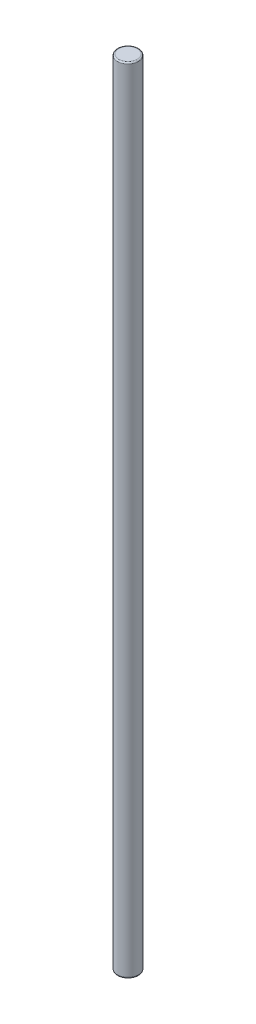
ISO-10303-21;
HEADER;
FILE_DESCRIPTION(('STEP AP214'),'2;1');
FILE_NAME('part.step','',(''),(''),'','','');
FILE_SCHEMA(('AUTOMOTIVE_DESIGN { 1 0 10303 214 1 1 1 1 }'));
ENDSEC;
DATA;
#1=APPLICATION_CONTEXT('core data for automotive mechanical design processes');
#2=APPLICATION_PROTOCOL_DEFINITION('international standard','automotive_design',2000,#1);
#3=PRODUCT_CONTEXT('',#1,'mechanical');
#4=PRODUCT('Part','Part','',(#3));
#5=PRODUCT_RELATED_PRODUCT_CATEGORY('part','',(#4));
#6=PRODUCT_DEFINITION_FORMATION('','',#4);
#7=PRODUCT_DEFINITION_CONTEXT('part definition',#1,'design');
#8=PRODUCT_DEFINITION('design','',#6,#7);
#9=PRODUCT_DEFINITION_SHAPE('','',#8);
#10=(LENGTH_UNIT() NAMED_UNIT(*) SI_UNIT(.MILLI.,.METRE.));
#11=(NAMED_UNIT(*) PLANE_ANGLE_UNIT() SI_UNIT($,.RADIAN.));
#12=(NAMED_UNIT(*) SI_UNIT($,.STERADIAN.) SOLID_ANGLE_UNIT());
#13=UNCERTAINTY_MEASURE_WITH_UNIT(LENGTH_MEASURE(1.E-05),#10,'distance_accuracy_value','');
#14=(GEOMETRIC_REPRESENTATION_CONTEXT(3) GLOBAL_UNCERTAINTY_ASSIGNED_CONTEXT((#13)) GLOBAL_UNIT_ASSIGNED_CONTEXT((#10,
#11,#12)) REPRESENTATION_CONTEXT('',''));
#15=CARTESIAN_POINT('',(0.,0.,0.));
#16=DIRECTION('',(0.,0.,1.));
#17=DIRECTION('',(1.,0.,0.));
#18=AXIS2_PLACEMENT_3D('',#15,#16,#17);
#19=CARTESIAN_POINT('',(0.,300.,0.));
#20=DIRECTION('',(0.,-1.,0.));
#21=DIRECTION('',(0.,0.,-1.));
#22=AXIS2_PLACEMENT_3D('',#19,#20,#21);
#23=CYLINDRICAL_SURFACE('',#22,4.);
#24=CARTESIAN_POINT('',(0.,299.5,0.));
#25=DIRECTION('',(0.,1.,0.));
#26=DIRECTION('',(0.,0.,1.));
#27=AXIS2_PLACEMENT_3D('',#24,#25,#26);
#28=CIRCLE('',#27,4.);
#29=CARTESIAN_POINT('',(0.,299.5,4.));
#30=VERTEX_POINT('',#29);
#31=EDGE_CURVE('E38',#30,#30,#28,.F.);
#32=ORIENTED_EDGE('',*,*,#31,.T.);
#33=EDGE_LOOP('',(#32));
#34=FACE_BOUND('',#33,.T.);
#35=CARTESIAN_POINT('',(0.,0.5,0.));
#36=DIRECTION('',(0.,1.,0.));
#37=DIRECTION('',(0.,0.,1.));
#38=AXIS2_PLACEMENT_3D('',#35,#36,#37);
#39=CIRCLE('',#38,4.);
#40=CARTESIAN_POINT('',(0.,0.5,4.));
#41=VERTEX_POINT('',#40);
#42=EDGE_CURVE('E42',#41,#41,#39,.T.);
#43=ORIENTED_EDGE('',*,*,#42,.T.);
#44=EDGE_LOOP('',(#43));
#45=FACE_BOUND('',#44,.T.);
#46=ADVANCED_FACE('F31',(#34,#45),#23,.T.);
#47=CARTESIAN_POINT('',(0.,300.,0.));
#48=DIRECTION('',(0.,1.,0.));
#49=DIRECTION('',(0.,0.,1.));
#50=AXIS2_PLACEMENT_3D('',#47,#48,#49);
#51=PLANE('',#50);
#52=CARTESIAN_POINT('',(0.,300.,0.));
#53=DIRECTION('',(0.,1.,0.));
#54=DIRECTION('',(0.,0.,1.));
#55=AXIS2_PLACEMENT_3D('',#52,#53,#54);
#56=CIRCLE('',#55,3.5);
#57=CARTESIAN_POINT('',(0.,300.,3.5));
#58=VERTEX_POINT('',#57);
#59=EDGE_CURVE('E46',#58,#58,#56,.T.);
#60=ORIENTED_EDGE('',*,*,#59,.T.);
#61=EDGE_LOOP('',(#60));
#62=FACE_BOUND('',#61,.T.);
#63=ADVANCED_FACE('F52',(#62),#51,.T.);
#64=CARTESIAN_POINT('',(0.,0.,0.));
#65=DIRECTION('',(0.,1.,0.));
#66=DIRECTION('',(0.,0.,1.));
#67=AXIS2_PLACEMENT_3D('',#64,#65,#66);
#68=PLANE('',#67);
#69=CARTESIAN_POINT('',(0.,0.,0.));
#70=DIRECTION('',(0.,1.,0.));
#71=DIRECTION('',(0.,0.,1.));
#72=AXIS2_PLACEMENT_3D('',#69,#70,#71);
#73=CIRCLE('',#72,3.5);
#74=CARTESIAN_POINT('',(0.,0.,3.5));
#75=VERTEX_POINT('',#74);
#76=EDGE_CURVE('E10',#75,#75,#73,.F.);
#77=ORIENTED_EDGE('',*,*,#76,.T.);
#78=EDGE_LOOP('',(#77));
#79=FACE_BOUND('',#78,.T.);
#80=ADVANCED_FACE('F56',(#79),#68,.F.);
#81=CARTESIAN_POINT('',(0.,299.5,0.));
#82=DIRECTION('',(0.,1.,0.));
#83=DIRECTION('',(0.,0.,1.));
#84=AXIS2_PLACEMENT_3D('',#81,#82,#83);
#85=TOROIDAL_SURFACE('',#84,3.5,0.5);
#86=ORIENTED_EDGE('',*,*,#31,.F.);
#87=EDGE_LOOP('',(#86));
#88=FACE_BOUND('',#87,.T.);
#89=ORIENTED_EDGE('',*,*,#59,.F.);
#90=EDGE_LOOP('',(#89));
#91=FACE_BOUND('',#90,.T.);
#92=ADVANCED_FACE('F54',(#88,#91),#85,.T.);
#93=CARTESIAN_POINT('',(0.,0.5,0.));
#94=DIRECTION('',(0.,1.,0.));
#95=DIRECTION('',(0.,0.,1.));
#96=AXIS2_PLACEMENT_3D('',#93,#94,#95);
#97=TOROIDAL_SURFACE('',#96,3.5,0.5);
#98=ORIENTED_EDGE('',*,*,#76,.F.);
#99=EDGE_LOOP('',(#98));
#100=FACE_BOUND('',#99,.T.);
#101=ORIENTED_EDGE('',*,*,#42,.F.);
#102=EDGE_LOOP('',(#101));
#103=FACE_BOUND('',#102,.T.);
#104=ADVANCED_FACE('F33',(#100,#103),#97,.T.);
#105=CLOSED_SHELL('',(#46,#63,#80,#92,#104));
#106=MANIFOLD_SOLID_BREP('B2',#105);
#107=ADVANCED_BREP_SHAPE_REPRESENTATION('',(#18,#106),#14);
#108=SHAPE_DEFINITION_REPRESENTATION(#9,#107);
ENDSEC;
END-ISO-10303-21;
